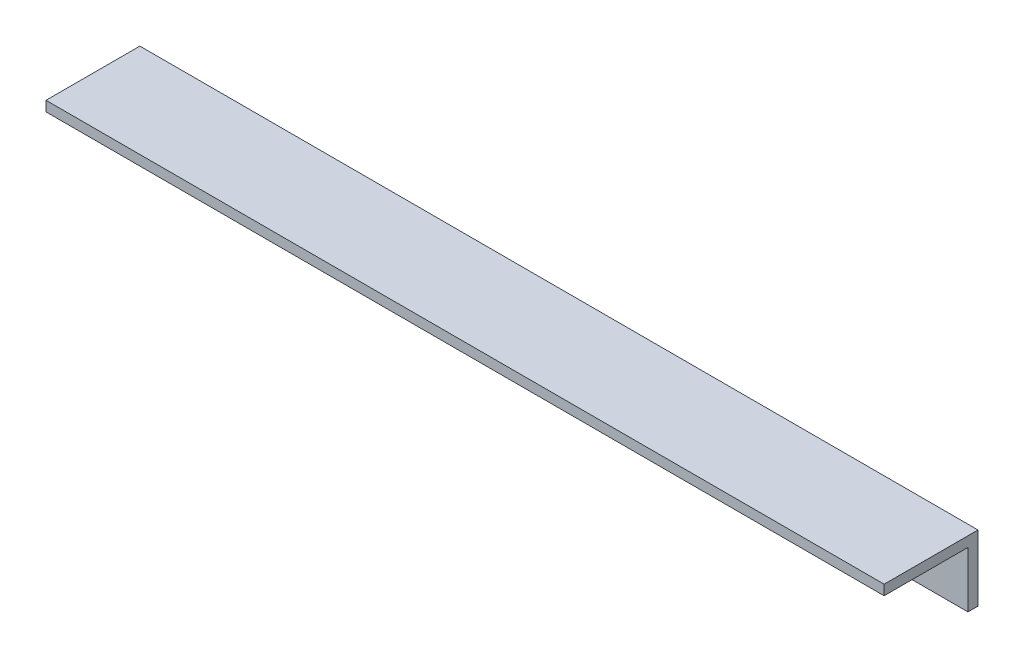
ISO-10303-21;
HEADER;
FILE_DESCRIPTION(('STEP AP214'),'2;1');
FILE_NAME('part.step','',(''),(''),'','','');
FILE_SCHEMA(('AUTOMOTIVE_DESIGN { 1 0 10303 214 1 1 1 1 }'));
ENDSEC;
DATA;
#1=APPLICATION_CONTEXT('core data for automotive mechanical design processes');
#2=APPLICATION_PROTOCOL_DEFINITION('international standard','automotive_design',2000,#1);
#3=PRODUCT_CONTEXT('',#1,'mechanical');
#4=PRODUCT('Part','Part','',(#3));
#5=PRODUCT_RELATED_PRODUCT_CATEGORY('part','',(#4));
#6=PRODUCT_DEFINITION_FORMATION('','',#4);
#7=PRODUCT_DEFINITION_CONTEXT('part definition',#1,'design');
#8=PRODUCT_DEFINITION('design','',#6,#7);
#9=PRODUCT_DEFINITION_SHAPE('','',#8);
#10=(LENGTH_UNIT() NAMED_UNIT(*) SI_UNIT(.MILLI.,.METRE.));
#11=(NAMED_UNIT(*) PLANE_ANGLE_UNIT() SI_UNIT($,.RADIAN.));
#12=(NAMED_UNIT(*) SI_UNIT($,.STERADIAN.) SOLID_ANGLE_UNIT());
#13=UNCERTAINTY_MEASURE_WITH_UNIT(LENGTH_MEASURE(1.E-05),#10,'distance_accuracy_value','');
#14=(GEOMETRIC_REPRESENTATION_CONTEXT(3) GLOBAL_UNCERTAINTY_ASSIGNED_CONTEXT((#13)) GLOBAL_UNIT_ASSIGNED_CONTEXT((#10,
#11,#12)) REPRESENTATION_CONTEXT('',''));
#15=CARTESIAN_POINT('',(0.,0.,0.));
#16=DIRECTION('',(0.,0.,1.));
#17=DIRECTION('',(1.,0.,0.));
#18=AXIS2_PLACEMENT_3D('',#15,#16,#17);
#19=CARTESIAN_POINT('',(1500.,0.,0.));
#20=DIRECTION('',(0.,1.,0.));
#21=DIRECTION('',(0.,0.,1.));
#22=AXIS2_PLACEMENT_3D('',#19,#20,#21);
#23=PLANE('',#22);
#24=DIRECTION('',(0.,0.,-1.));
#25=VECTOR('',#24,1.);
#26=CARTESIAN_POINT('',(0.,0.,0.));
#27=LINE('',#26,#25);
#28=CARTESIAN_POINT('',(0.,0.,0.));
#29=VERTEX_POINT('',#28);
#30=CARTESIAN_POINT('',(0.,0.,-18.));
#31=VERTEX_POINT('',#30);
#32=EDGE_CURVE('E117',#29,#31,#27,.T.);
#33=ORIENTED_EDGE('',*,*,#32,.T.);
#34=DIRECTION('',(-1.,0.,0.));
#35=VECTOR('',#34,1.);
#36=CARTESIAN_POINT('',(1500.,0.,-18.));
#37=LINE('',#36,#35);
#38=CARTESIAN_POINT('',(1500.,0.,-18.));
#39=VERTEX_POINT('',#38);
#40=EDGE_CURVE('E11',#39,#31,#37,.T.);
#41=ORIENTED_EDGE('',*,*,#40,.F.);
#42=DIRECTION('',(0.,0.,-1.));
#43=VECTOR('',#42,1.);
#44=CARTESIAN_POINT('',(1500.,0.,0.));
#45=LINE('',#44,#43);
#46=CARTESIAN_POINT('',(1500.,0.,0.));
#47=VERTEX_POINT('',#46);
#48=EDGE_CURVE('E127',#47,#39,#45,.T.);
#49=ORIENTED_EDGE('',*,*,#48,.F.);
#50=DIRECTION('',(-1.,0.,0.));
#51=VECTOR('',#50,1.);
#52=CARTESIAN_POINT('',(1500.,0.,0.));
#53=LINE('',#52,#51);
#54=EDGE_CURVE('E113',#47,#29,#53,.T.);
#55=ORIENTED_EDGE('',*,*,#54,.T.);
#56=EDGE_LOOP('',(#33,#41,#49,#55));
#57=FACE_BOUND('',#56,.T.);
#58=ADVANCED_FACE('F33',(#57),#23,.F.);
#59=CARTESIAN_POINT('',(1500.,0.,-18.));
#60=DIRECTION('',(0.,0.,1.));
#61=DIRECTION('',(1.,0.,0.));
#62=AXIS2_PLACEMENT_3D('',#59,#60,#61);
#63=PLANE('',#62);
#64=DIRECTION('',(0.,1.,0.));
#65=VECTOR('',#64,1.);
#66=CARTESIAN_POINT('',(0.,0.,-18.));
#67=LINE('',#66,#65);
#68=CARTESIAN_POINT('',(0.,118.,-18.));
#69=VERTEX_POINT('',#68);
#70=EDGE_CURVE('E120',#31,#69,#67,.T.);
#71=ORIENTED_EDGE('',*,*,#70,.T.);
#72=DIRECTION('',(-1.,0.,0.));
#73=VECTOR('',#72,1.);
#74=CARTESIAN_POINT('',(1500.,118.,-18.));
#75=LINE('',#74,#73);
#76=CARTESIAN_POINT('',(1500.,118.,-18.));
#77=VERTEX_POINT('',#76);
#78=EDGE_CURVE('E41',#77,#69,#75,.T.);
#79=ORIENTED_EDGE('',*,*,#78,.F.);
#80=DIRECTION('',(0.,1.,0.));
#81=VECTOR('',#80,1.);
#82=CARTESIAN_POINT('',(1500.,0.,-18.));
#83=LINE('',#82,#81);
#84=EDGE_CURVE('E86',#39,#77,#83,.T.);
#85=ORIENTED_EDGE('',*,*,#84,.F.);
#86=ORIENTED_EDGE('',*,*,#40,.T.);
#87=EDGE_LOOP('',(#71,#79,#85,#86));
#88=FACE_BOUND('',#87,.T.);
#89=ADVANCED_FACE('F151',(#88),#63,.F.);
#90=CARTESIAN_POINT('',(1500.,118.,-18.));
#91=DIRECTION('',(0.,-1.,0.));
#92=DIRECTION('',(0.,0.,-1.));
#93=AXIS2_PLACEMENT_3D('',#90,#91,#92);
#94=PLANE('',#93);
#95=DIRECTION('',(0.,0.,1.));
#96=VECTOR('',#95,1.);
#97=CARTESIAN_POINT('',(0.,118.,-18.));
#98=LINE('',#97,#96);
#99=CARTESIAN_POINT('',(0.,118.,150.));
#100=VERTEX_POINT('',#99);
#101=EDGE_CURVE('E122',#69,#100,#98,.T.);
#102=ORIENTED_EDGE('',*,*,#101,.T.);
#103=DIRECTION('',(-1.,0.,0.));
#104=VECTOR('',#103,1.);
#105=CARTESIAN_POINT('',(1500.,118.,150.));
#106=LINE('',#105,#104);
#107=CARTESIAN_POINT('',(1500.,118.,150.));
#108=VERTEX_POINT('',#107);
#109=EDGE_CURVE('E108',#108,#100,#106,.T.);
#110=ORIENTED_EDGE('',*,*,#109,.F.);
#111=DIRECTION('',(0.,0.,1.));
#112=VECTOR('',#111,1.);
#113=CARTESIAN_POINT('',(1500.,118.,-18.));
#114=LINE('',#113,#112);
#115=EDGE_CURVE('E99',#77,#108,#114,.T.);
#116=ORIENTED_EDGE('',*,*,#115,.F.);
#117=ORIENTED_EDGE('',*,*,#78,.T.);
#118=EDGE_LOOP('',(#102,#110,#116,#117));
#119=FACE_BOUND('',#118,.T.);
#120=ADVANCED_FACE('F133',(#119),#94,.F.);
#121=CARTESIAN_POINT('',(1500.,100.,150.));
#122=DIRECTION('',(0.,0.,-1.));
#123=DIRECTION('',(-1.,0.,0.));
#124=AXIS2_PLACEMENT_3D('',#121,#122,#123);
#125=PLANE('',#124);
#126=DIRECTION('',(0.,-1.,0.));
#127=VECTOR('',#126,1.);
#128=CARTESIAN_POINT('',(0.,100.,150.));
#129=LINE('',#128,#127);
#130=CARTESIAN_POINT('',(0.,100.,150.));
#131=VERTEX_POINT('',#130);
#132=EDGE_CURVE('E107',#100,#131,#129,.T.);
#133=ORIENTED_EDGE('',*,*,#132,.T.);
#134=DIRECTION('',(-1.,0.,0.));
#135=VECTOR('',#134,1.);
#136=CARTESIAN_POINT('',(1500.,100.,150.));
#137=LINE('',#136,#135);
#138=CARTESIAN_POINT('',(1500.,100.,150.));
#139=VERTEX_POINT('',#138);
#140=EDGE_CURVE('E104',#139,#131,#137,.T.);
#141=ORIENTED_EDGE('',*,*,#140,.F.);
#142=DIRECTION('',(0.,-1.,0.));
#143=VECTOR('',#142,1.);
#144=CARTESIAN_POINT('',(1500.,100.,150.));
#145=LINE('',#144,#143);
#146=EDGE_CURVE('E93',#108,#139,#145,.T.);
#147=ORIENTED_EDGE('',*,*,#146,.F.);
#148=ORIENTED_EDGE('',*,*,#109,.T.);
#149=EDGE_LOOP('',(#133,#141,#147,#148));
#150=FACE_BOUND('',#149,.T.);
#151=ADVANCED_FACE('F105',(#150),#125,.F.);
#152=CARTESIAN_POINT('',(1500.,100.,0.));
#153=DIRECTION('',(0.,1.,0.));
#154=DIRECTION('',(0.,0.,1.));
#155=AXIS2_PLACEMENT_3D('',#152,#153,#154);
#156=PLANE('',#155);
#157=DIRECTION('',(0.,0.,-1.));
#158=VECTOR('',#157,1.);
#159=CARTESIAN_POINT('',(0.,100.,0.));
#160=LINE('',#159,#158);
#161=CARTESIAN_POINT('',(0.,100.,0.));
#162=VERTEX_POINT('',#161);
#163=EDGE_CURVE('E72',#131,#162,#160,.T.);
#164=ORIENTED_EDGE('',*,*,#163,.T.);
#165=DIRECTION('',(-1.,0.,0.));
#166=VECTOR('',#165,1.);
#167=CARTESIAN_POINT('',(1500.,100.,0.));
#168=LINE('',#167,#166);
#169=CARTESIAN_POINT('',(1500.,100.,0.));
#170=VERTEX_POINT('',#169);
#171=EDGE_CURVE('E109',#170,#162,#168,.T.);
#172=ORIENTED_EDGE('',*,*,#171,.F.);
#173=DIRECTION('',(0.,0.,-1.));
#174=VECTOR('',#173,1.);
#175=CARTESIAN_POINT('',(1500.,100.,0.));
#176=LINE('',#175,#174);
#177=EDGE_CURVE('E97',#139,#170,#176,.T.);
#178=ORIENTED_EDGE('',*,*,#177,.F.);
#179=ORIENTED_EDGE('',*,*,#140,.T.);
#180=EDGE_LOOP('',(#164,#172,#178,#179));
#181=FACE_BOUND('',#180,.T.);
#182=ADVANCED_FACE('F111',(#181),#156,.F.);
#183=CARTESIAN_POINT('',(1500.,0.,0.));
#184=DIRECTION('',(0.,0.,-1.));
#185=DIRECTION('',(-1.,0.,0.));
#186=AXIS2_PLACEMENT_3D('',#183,#184,#185);
#187=PLANE('',#186);
#188=DIRECTION('',(0.,-1.,0.));
#189=VECTOR('',#188,1.);
#190=CARTESIAN_POINT('',(0.,0.,0.));
#191=LINE('',#190,#189);
#192=EDGE_CURVE('E78',#162,#29,#191,.T.);
#193=ORIENTED_EDGE('',*,*,#192,.T.);
#194=ORIENTED_EDGE('',*,*,#54,.F.);
#195=DIRECTION('',(0.,-1.,0.));
#196=VECTOR('',#195,1.);
#197=CARTESIAN_POINT('',(1500.,0.,0.));
#198=LINE('',#197,#196);
#199=EDGE_CURVE('E49',#170,#47,#198,.T.);
#200=ORIENTED_EDGE('',*,*,#199,.F.);
#201=ORIENTED_EDGE('',*,*,#171,.T.);
#202=EDGE_LOOP('',(#193,#194,#200,#201));
#203=FACE_BOUND('',#202,.T.);
#204=ADVANCED_FACE('F140',(#203),#187,.F.);
#205=CARTESIAN_POINT('',(1500.,0.,0.));
#206=DIRECTION('',(1.,0.,0.));
#207=DIRECTION('',(0.,0.,-1.));
#208=AXIS2_PLACEMENT_3D('',#205,#206,#207);
#209=PLANE('',#208);
#210=ORIENTED_EDGE('',*,*,#48,.T.);
#211=ORIENTED_EDGE('',*,*,#84,.T.);
#212=ORIENTED_EDGE('',*,*,#115,.T.);
#213=ORIENTED_EDGE('',*,*,#146,.T.);
#214=ORIENTED_EDGE('',*,*,#177,.T.);
#215=ORIENTED_EDGE('',*,*,#199,.T.);
#216=EDGE_LOOP('',(#210,#211,#212,#213,#214,#215));
#217=FACE_BOUND('',#216,.T.);
#218=ADVANCED_FACE('F95',(#217),#209,.T.);
#219=CARTESIAN_POINT('',(0.,0.,0.));
#220=DIRECTION('',(1.,0.,0.));
#221=DIRECTION('',(0.,0.,-1.));
#222=AXIS2_PLACEMENT_3D('',#219,#220,#221);
#223=PLANE('',#222);
#224=ORIENTED_EDGE('',*,*,#32,.F.);
#225=ORIENTED_EDGE('',*,*,#192,.F.);
#226=ORIENTED_EDGE('',*,*,#163,.F.);
#227=ORIENTED_EDGE('',*,*,#132,.F.);
#228=ORIENTED_EDGE('',*,*,#101,.F.);
#229=ORIENTED_EDGE('',*,*,#70,.F.);
#230=EDGE_LOOP('',(#224,#225,#226,#227,#228,#229));
#231=FACE_BOUND('',#230,.T.);
#232=ADVANCED_FACE('F136',(#231),#223,.F.);
#233=CLOSED_SHELL('',(#58,#89,#120,#151,#182,#204,#218,#232));
#234=MANIFOLD_SOLID_BREP('B2',#233);
#235=ADVANCED_BREP_SHAPE_REPRESENTATION('',(#18,#234),#14);
#236=SHAPE_DEFINITION_REPRESENTATION(#9,#235);
ENDSEC;
END-ISO-10303-21;
